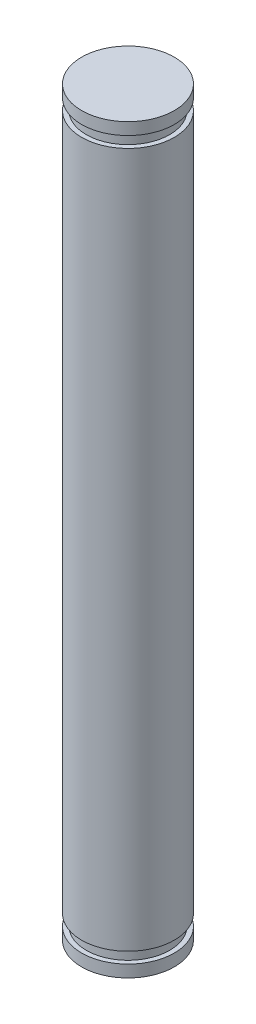
ISO-10303-21;
HEADER;
FILE_DESCRIPTION(('STEP AP214'),'2;1');
FILE_NAME('part.step','',(''),(''),'','','');
FILE_SCHEMA(('AUTOMOTIVE_DESIGN { 1 0 10303 214 1 1 1 1 }'));
ENDSEC;
DATA;
#1=APPLICATION_CONTEXT('core data for automotive mechanical design processes');
#2=APPLICATION_PROTOCOL_DEFINITION('international standard','automotive_design',2000,#1);
#3=PRODUCT_CONTEXT('',#1,'mechanical');
#4=PRODUCT('Part','Part','',(#3));
#5=PRODUCT_RELATED_PRODUCT_CATEGORY('part','',(#4));
#6=PRODUCT_DEFINITION_FORMATION('','',#4);
#7=PRODUCT_DEFINITION_CONTEXT('part definition',#1,'design');
#8=PRODUCT_DEFINITION('design','',#6,#7);
#9=PRODUCT_DEFINITION_SHAPE('','',#8);
#10=(LENGTH_UNIT() NAMED_UNIT(*) SI_UNIT(.MILLI.,.METRE.));
#11=(NAMED_UNIT(*) PLANE_ANGLE_UNIT() SI_UNIT($,.RADIAN.));
#12=(NAMED_UNIT(*) SI_UNIT($,.STERADIAN.) SOLID_ANGLE_UNIT());
#13=UNCERTAINTY_MEASURE_WITH_UNIT(LENGTH_MEASURE(1.E-05),#10,'distance_accuracy_value','');
#14=(GEOMETRIC_REPRESENTATION_CONTEXT(3) GLOBAL_UNCERTAINTY_ASSIGNED_CONTEXT((#13)) GLOBAL_UNIT_ASSIGNED_CONTEXT((#10,
#11,#12)) REPRESENTATION_CONTEXT('',''));
#15=CARTESIAN_POINT('',(0.,0.,0.));
#16=DIRECTION('',(0.,0.,1.));
#17=DIRECTION('',(1.,0.,0.));
#18=AXIS2_PLACEMENT_3D('',#15,#16,#17);
#19=CARTESIAN_POINT('',(0.,0.,0.));
#20=DIRECTION('',(0.,-1.,0.));
#21=DIRECTION('',(0.,0.,-1.));
#22=AXIS2_PLACEMENT_3D('',#19,#20,#21);
#23=PLANE('',#22);
#24=CARTESIAN_POINT('',(0.,0.,0.));
#25=DIRECTION('',(0.,1.,0.));
#26=DIRECTION('',(0.,0.,1.));
#27=AXIS2_PLACEMENT_3D('',#24,#25,#26);
#28=CIRCLE('',#27,5.);
#29=CARTESIAN_POINT('',(0.,0.,5.));
#30=VERTEX_POINT('',#29);
#31=EDGE_CURVE('E10',#30,#30,#28,.T.);
#32=ORIENTED_EDGE('',*,*,#31,.F.);
#33=EDGE_LOOP('',(#32));
#34=FACE_BOUND('',#33,.T.);
#35=ADVANCED_FACE('F37',(#34),#23,.T.);
#36=CARTESIAN_POINT('',(0.,80.,0.));
#37=DIRECTION('',(0.,1.,0.));
#38=DIRECTION('',(0.,0.,1.));
#39=AXIS2_PLACEMENT_3D('',#36,#37,#38);
#40=CYLINDRICAL_SURFACE('',#39,5.);
#41=ORIENTED_EDGE('',*,*,#31,.T.);
#42=EDGE_LOOP('',(#41));
#43=FACE_BOUND('',#42,.T.);
#44=CARTESIAN_POINT('',(0.,1.3,0.));
#45=DIRECTION('',(0.,1.,0.));
#46=DIRECTION('',(0.,0.,1.));
#47=AXIS2_PLACEMENT_3D('',#44,#45,#46);
#48=CIRCLE('',#47,5.);
#49=CARTESIAN_POINT('',(0.,1.3,5.));
#50=VERTEX_POINT('',#49);
#51=EDGE_CURVE('E44',#50,#50,#48,.T.);
#52=ORIENTED_EDGE('',*,*,#51,.F.);
#53=EDGE_LOOP('',(#52));
#54=FACE_BOUND('',#53,.T.);
#55=ADVANCED_FACE('F101',(#43,#54),#40,.T.);
#56=CARTESIAN_POINT('',(-5.,1.30000000000001,0.));
#57=DIRECTION('',(0.,1.,0.));
#58=DIRECTION('',(0.,0.,1.));
#59=AXIS2_PLACEMENT_3D('',#56,#57,#58);
#60=PLANE('',#59);
#61=ORIENTED_EDGE('',*,*,#51,.T.);
#62=EDGE_LOOP('',(#61));
#63=FACE_BOUND('',#62,.T.);
#64=CARTESIAN_POINT('',(0.,1.30000000000001,0.));
#65=DIRECTION('',(0.,1.,0.));
#66=DIRECTION('',(0.,0.,1.));
#67=AXIS2_PLACEMENT_3D('',#64,#65,#66);
#68=CIRCLE('',#67,4.5);
#69=CARTESIAN_POINT('',(0.,1.30000000000001,4.5));
#70=VERTEX_POINT('',#69);
#71=EDGE_CURVE('E49',#70,#70,#68,.T.);
#72=ORIENTED_EDGE('',*,*,#71,.F.);
#73=EDGE_LOOP('',(#72));
#74=FACE_BOUND('',#73,.T.);
#75=ADVANCED_FACE('F106',(#63,#74),#60,.T.);
#76=CARTESIAN_POINT('',(0.,80.,0.));
#77=DIRECTION('',(0.,1.,0.));
#78=DIRECTION('',(0.,0.,1.));
#79=AXIS2_PLACEMENT_3D('',#76,#77,#78);
#80=CYLINDRICAL_SURFACE('',#79,4.5);
#81=ORIENTED_EDGE('',*,*,#71,.T.);
#82=EDGE_LOOP('',(#81));
#83=FACE_BOUND('',#82,.T.);
#84=CARTESIAN_POINT('',(0.,2.50000000000002,0.));
#85=DIRECTION('',(0.,1.,0.));
#86=DIRECTION('',(0.,0.,1.));
#87=AXIS2_PLACEMENT_3D('',#84,#85,#86);
#88=CIRCLE('',#87,4.5);
#89=CARTESIAN_POINT('',(0.,2.50000000000002,4.5));
#90=VERTEX_POINT('',#89);
#91=EDGE_CURVE('E54',#90,#90,#88,.T.);
#92=ORIENTED_EDGE('',*,*,#91,.F.);
#93=EDGE_LOOP('',(#92));
#94=FACE_BOUND('',#93,.T.);
#95=ADVANCED_FACE('F110',(#83,#94),#80,.T.);
#96=CARTESIAN_POINT('',(-4.5,2.50000000000001,0.));
#97=DIRECTION('',(0.,-1.,0.));
#98=DIRECTION('',(0.,0.,-1.));
#99=AXIS2_PLACEMENT_3D('',#96,#97,#98);
#100=PLANE('',#99);
#101=ORIENTED_EDGE('',*,*,#91,.T.);
#102=EDGE_LOOP('',(#101));
#103=FACE_BOUND('',#102,.T.);
#104=CARTESIAN_POINT('',(0.,2.5,0.));
#105=DIRECTION('',(0.,1.,0.));
#106=DIRECTION('',(0.,0.,1.));
#107=AXIS2_PLACEMENT_3D('',#104,#105,#106);
#108=CIRCLE('',#107,5.);
#109=CARTESIAN_POINT('',(0.,2.5,5.));
#110=VERTEX_POINT('',#109);
#111=EDGE_CURVE('E60',#110,#110,#108,.T.);
#112=ORIENTED_EDGE('',*,*,#111,.F.);
#113=EDGE_LOOP('',(#112));
#114=FACE_BOUND('',#113,.T.);
#115=ADVANCED_FACE('F116',(#103,#114),#100,.T.);
#116=CARTESIAN_POINT('',(0.,80.,0.));
#117=DIRECTION('',(0.,1.,0.));
#118=DIRECTION('',(0.,0.,1.));
#119=AXIS2_PLACEMENT_3D('',#116,#117,#118);
#120=CYLINDRICAL_SURFACE('',#119,5.);
#121=ORIENTED_EDGE('',*,*,#111,.T.);
#122=EDGE_LOOP('',(#121));
#123=FACE_BOUND('',#122,.T.);
#124=CARTESIAN_POINT('',(0.,77.5,0.));
#125=DIRECTION('',(0.,1.,0.));
#126=DIRECTION('',(0.,0.,1.));
#127=AXIS2_PLACEMENT_3D('',#124,#125,#126);
#128=CIRCLE('',#127,5.);
#129=CARTESIAN_POINT('',(0.,77.5,5.));
#130=VERTEX_POINT('',#129);
#131=EDGE_CURVE('E64',#130,#130,#128,.T.);
#132=ORIENTED_EDGE('',*,*,#131,.F.);
#133=EDGE_LOOP('',(#132));
#134=FACE_BOUND('',#133,.T.);
#135=ADVANCED_FACE('F120',(#123,#134),#120,.T.);
#136=CARTESIAN_POINT('',(-5.,77.5,0.));
#137=DIRECTION('',(0.,1.,0.));
#138=DIRECTION('',(0.,0.,1.));
#139=AXIS2_PLACEMENT_3D('',#136,#137,#138);
#140=PLANE('',#139);
#141=ORIENTED_EDGE('',*,*,#131,.T.);
#142=EDGE_LOOP('',(#141));
#143=FACE_BOUND('',#142,.T.);
#144=CARTESIAN_POINT('',(0.,77.5,0.));
#145=DIRECTION('',(0.,1.,0.));
#146=DIRECTION('',(0.,0.,1.));
#147=AXIS2_PLACEMENT_3D('',#144,#145,#146);
#148=CIRCLE('',#147,4.5);
#149=CARTESIAN_POINT('',(0.,77.5,4.5));
#150=VERTEX_POINT('',#149);
#151=EDGE_CURVE('E68',#150,#150,#148,.T.);
#152=ORIENTED_EDGE('',*,*,#151,.F.);
#153=EDGE_LOOP('',(#152));
#154=FACE_BOUND('',#153,.T.);
#155=ADVANCED_FACE('F124',(#143,#154),#140,.T.);
#156=CARTESIAN_POINT('',(0.,80.,0.));
#157=DIRECTION('',(0.,1.,0.));
#158=DIRECTION('',(0.,0.,1.));
#159=AXIS2_PLACEMENT_3D('',#156,#157,#158);
#160=CYLINDRICAL_SURFACE('',#159,4.5);
#161=ORIENTED_EDGE('',*,*,#151,.T.);
#162=EDGE_LOOP('',(#161));
#163=FACE_BOUND('',#162,.T.);
#164=CARTESIAN_POINT('',(0.,78.7,0.));
#165=DIRECTION('',(0.,1.,0.));
#166=DIRECTION('',(0.,0.,1.));
#167=AXIS2_PLACEMENT_3D('',#164,#165,#166);
#168=CIRCLE('',#167,4.5);
#169=CARTESIAN_POINT('',(0.,78.7,4.5));
#170=VERTEX_POINT('',#169);
#171=EDGE_CURVE('E72',#170,#170,#168,.T.);
#172=ORIENTED_EDGE('',*,*,#171,.F.);
#173=EDGE_LOOP('',(#172));
#174=FACE_BOUND('',#173,.T.);
#175=ADVANCED_FACE('F97',(#163,#174),#160,.T.);
#176=CARTESIAN_POINT('',(-4.5,78.7,0.));
#177=DIRECTION('',(0.,-1.,0.));
#178=DIRECTION('',(0.,0.,-1.));
#179=AXIS2_PLACEMENT_3D('',#176,#177,#178);
#180=PLANE('',#179);
#181=ORIENTED_EDGE('',*,*,#171,.T.);
#182=EDGE_LOOP('',(#181));
#183=FACE_BOUND('',#182,.T.);
#184=CARTESIAN_POINT('',(0.,78.7,0.));
#185=DIRECTION('',(0.,1.,0.));
#186=DIRECTION('',(0.,0.,1.));
#187=AXIS2_PLACEMENT_3D('',#184,#185,#186);
#188=CIRCLE('',#187,5.);
#189=CARTESIAN_POINT('',(0.,78.7,5.));
#190=VERTEX_POINT('',#189);
#191=EDGE_CURVE('E76',#190,#190,#188,.T.);
#192=ORIENTED_EDGE('',*,*,#191,.F.);
#193=EDGE_LOOP('',(#192));
#194=FACE_BOUND('',#193,.T.);
#195=ADVANCED_FACE('F89',(#183,#194),#180,.T.);
#196=CARTESIAN_POINT('',(0.,80.,0.));
#197=DIRECTION('',(0.,1.,0.));
#198=DIRECTION('',(0.,0.,1.));
#199=AXIS2_PLACEMENT_3D('',#196,#197,#198);
#200=CYLINDRICAL_SURFACE('',#199,5.);
#201=ORIENTED_EDGE('',*,*,#191,.T.);
#202=EDGE_LOOP('',(#201));
#203=FACE_BOUND('',#202,.T.);
#204=CARTESIAN_POINT('',(0.,80.,0.));
#205=DIRECTION('',(0.,1.,0.));
#206=DIRECTION('',(0.,0.,1.));
#207=AXIS2_PLACEMENT_3D('',#204,#205,#206);
#208=CIRCLE('',#207,5.);
#209=CARTESIAN_POINT('',(0.,80.,5.));
#210=VERTEX_POINT('',#209);
#211=EDGE_CURVE('E80',#210,#210,#208,.T.);
#212=ORIENTED_EDGE('',*,*,#211,.F.);
#213=EDGE_LOOP('',(#212));
#214=FACE_BOUND('',#213,.T.);
#215=ADVANCED_FACE('F87',(#203,#214),#200,.T.);
#216=CARTESIAN_POINT('',(-5.,80.,0.));
#217=DIRECTION('',(0.,1.,0.));
#218=DIRECTION('',(0.,0.,1.));
#219=AXIS2_PLACEMENT_3D('',#216,#217,#218);
#220=PLANE('',#219);
#221=ORIENTED_EDGE('',*,*,#211,.T.);
#222=EDGE_LOOP('',(#221));
#223=FACE_BOUND('',#222,.T.);
#224=ADVANCED_FACE('F85',(#223),#220,.T.);
#225=CLOSED_SHELL('',(#35,#55,#75,#95,#115,#135,#155,#175,#195,#215,#224));
#226=MANIFOLD_SOLID_BREP('B2',#225);
#227=ADVANCED_BREP_SHAPE_REPRESENTATION('',(#18,#226),#14);
#228=SHAPE_DEFINITION_REPRESENTATION(#9,#227);
ENDSEC;
END-ISO-10303-21;
